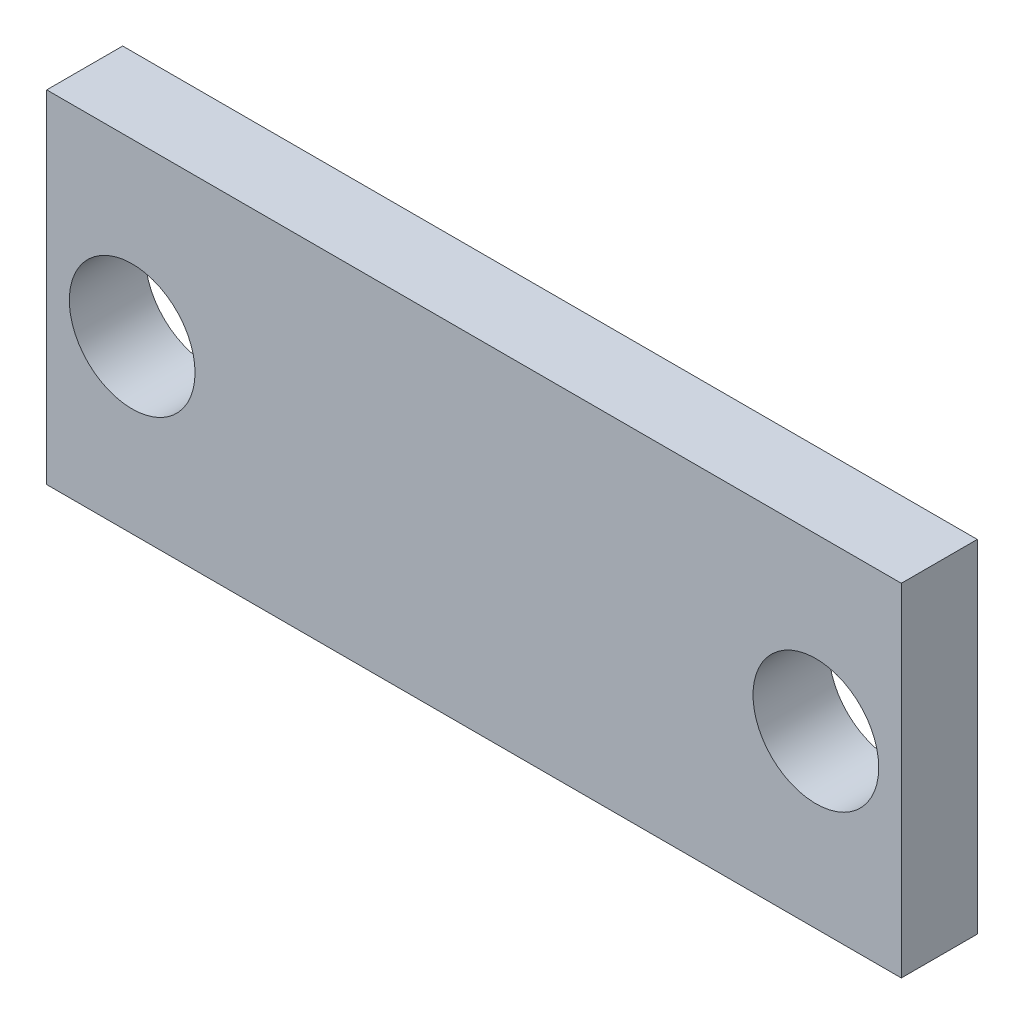
ISO-10303-21;
HEADER;
FILE_DESCRIPTION(('STEP AP214'),'2;1');
FILE_NAME('part.step','',(''),(''),'','','');
FILE_SCHEMA(('AUTOMOTIVE_DESIGN { 1 0 10303 214 1 1 1 1 }'));
ENDSEC;
DATA;
#1=APPLICATION_CONTEXT('core data for automotive mechanical design processes');
#2=APPLICATION_PROTOCOL_DEFINITION('international standard','automotive_design',2000,#1);
#3=PRODUCT_CONTEXT('',#1,'mechanical');
#4=PRODUCT('Part','Part','',(#3));
#5=PRODUCT_RELATED_PRODUCT_CATEGORY('part','',(#4));
#6=PRODUCT_DEFINITION_FORMATION('','',#4);
#7=PRODUCT_DEFINITION_CONTEXT('part definition',#1,'design');
#8=PRODUCT_DEFINITION('design','',#6,#7);
#9=PRODUCT_DEFINITION_SHAPE('','',#8);
#10=(LENGTH_UNIT() NAMED_UNIT(*) SI_UNIT(.MILLI.,.METRE.));
#11=(NAMED_UNIT(*) PLANE_ANGLE_UNIT() SI_UNIT($,.RADIAN.));
#12=(NAMED_UNIT(*) SI_UNIT($,.STERADIAN.) SOLID_ANGLE_UNIT());
#13=UNCERTAINTY_MEASURE_WITH_UNIT(LENGTH_MEASURE(1.E-05),#10,'distance_accuracy_value','');
#14=(GEOMETRIC_REPRESENTATION_CONTEXT(3) GLOBAL_UNCERTAINTY_ASSIGNED_CONTEXT((#13)) GLOBAL_UNIT_ASSIGNED_CONTEXT((#10,
#11,#12)) REPRESENTATION_CONTEXT('',''));
#15=CARTESIAN_POINT('',(0.,0.,0.));
#16=DIRECTION('',(0.,0.,1.));
#17=DIRECTION('',(1.,0.,0.));
#18=AXIS2_PLACEMENT_3D('',#15,#16,#17);
#19=CARTESIAN_POINT('',(0.,0.,2.));
#20=DIRECTION('',(0.,0.,1.));
#21=DIRECTION('',(1.,0.,0.));
#22=AXIS2_PLACEMENT_3D('',#19,#20,#21);
#23=PLANE('',#22);
#24=CARTESIAN_POINT('',(-8.37182741116752,10.1226663178173,2.));
#25=DIRECTION('',(0.,0.,1.));
#26=DIRECTION('',(1.,0.,0.));
#27=AXIS2_PLACEMENT_3D('',#24,#25,#26);
#28=CIRCLE('',#27,1.655);
#29=CARTESIAN_POINT('',(-6.71682741116751,10.1226663178173,2.));
#30=VERTEX_POINT('',#29);
#31=EDGE_CURVE('E112',#30,#30,#28,.T.);
#32=ORIENTED_EDGE('',*,*,#31,.F.);
#33=EDGE_LOOP('',(#32));
#34=FACE_BOUND('',#33,.T.);
#35=DIRECTION('',(0.,-1.,0.));
#36=VECTOR('',#35,1.);
#37=CARTESIAN_POINT('',(-10.6218274111675,14.6192893401015,2.));
#38=LINE('',#37,#36);
#39=CARTESIAN_POINT('',(-10.6218274111675,14.6192893401015,2.));
#40=VERTEX_POINT('',#39);
#41=CARTESIAN_POINT('',(-10.6218274111675,5.61928934010152,2.));
#42=VERTEX_POINT('',#41);
#43=EDGE_CURVE('E92',#40,#42,#38,.T.);
#44=ORIENTED_EDGE('',*,*,#43,.T.);
#45=DIRECTION('',(1.,0.,0.));
#46=VECTOR('',#45,1.);
#47=CARTESIAN_POINT('',(-10.6218274111675,5.61928934010152,2.));
#48=LINE('',#47,#46);
#49=CARTESIAN_POINT('',(11.8781725888325,5.61928934010152,2.));
#50=VERTEX_POINT('',#49);
#51=EDGE_CURVE('E87',#42,#50,#48,.T.);
#52=ORIENTED_EDGE('',*,*,#51,.T.);
#53=DIRECTION('',(0.,1.,0.));
#54=VECTOR('',#53,1.);
#55=CARTESIAN_POINT('',(11.8781725888325,14.6192893401015,2.));
#56=LINE('',#55,#54);
#57=CARTESIAN_POINT('',(11.8781725888325,14.6192893401015,2.));
#58=VERTEX_POINT('',#57);
#59=EDGE_CURVE('E90',#50,#58,#56,.T.);
#60=ORIENTED_EDGE('',*,*,#59,.T.);
#61=DIRECTION('',(-1.,0.,0.));
#62=VECTOR('',#61,1.);
#63=CARTESIAN_POINT('',(-10.6218274111675,14.6192893401015,2.));
#64=LINE('',#63,#62);
#65=EDGE_CURVE('E57',#58,#40,#64,.T.);
#66=ORIENTED_EDGE('',*,*,#65,.T.);
#67=EDGE_LOOP('',(#44,#52,#60,#66));
#68=FACE_BOUND('',#67,.T.);
#69=CARTESIAN_POINT('',(9.62817258883249,10.1226663178173,2.));
#70=DIRECTION('',(0.,0.,1.));
#71=DIRECTION('',(1.,0.,0.));
#72=AXIS2_PLACEMENT_3D('',#69,#70,#71);
#73=CIRCLE('',#72,1.655);
#74=CARTESIAN_POINT('',(11.2831725888325,10.1226663178173,2.));
#75=VERTEX_POINT('',#74);
#76=EDGE_CURVE('E134',#75,#75,#73,.T.);
#77=ORIENTED_EDGE('',*,*,#76,.F.);
#78=EDGE_LOOP('',(#77));
#79=FACE_BOUND('',#78,.T.);
#80=ADVANCED_FACE('F39',(#34,#68,#79),#23,.T.);
#81=CARTESIAN_POINT('',(0.,0.,0.));
#82=DIRECTION('',(0.,0.,1.));
#83=DIRECTION('',(1.,0.,0.));
#84=AXIS2_PLACEMENT_3D('',#81,#82,#83);
#85=PLANE('',#84);
#86=DIRECTION('',(0.,-1.,0.));
#87=VECTOR('',#86,1.);
#88=CARTESIAN_POINT('',(-10.6218274111675,14.6192893401015,0.));
#89=LINE('',#88,#87);
#90=CARTESIAN_POINT('',(-10.6218274111675,14.6192893401015,0.));
#91=VERTEX_POINT('',#90);
#92=CARTESIAN_POINT('',(-10.6218274111675,5.61928934010152,0.));
#93=VERTEX_POINT('',#92);
#94=EDGE_CURVE('E108',#91,#93,#89,.T.);
#95=ORIENTED_EDGE('',*,*,#94,.F.);
#96=DIRECTION('',(-1.,0.,0.));
#97=VECTOR('',#96,1.);
#98=CARTESIAN_POINT('',(-10.6218274111675,14.6192893401015,0.));
#99=LINE('',#98,#97);
#100=CARTESIAN_POINT('',(11.8781725888325,14.6192893401015,0.));
#101=VERTEX_POINT('',#100);
#102=EDGE_CURVE('E80',#101,#91,#99,.T.);
#103=ORIENTED_EDGE('',*,*,#102,.F.);
#104=DIRECTION('',(0.,1.,0.));
#105=VECTOR('',#104,1.);
#106=CARTESIAN_POINT('',(11.8781725888325,14.6192893401015,0.));
#107=LINE('',#106,#105);
#108=CARTESIAN_POINT('',(11.8781725888325,5.61928934010152,0.));
#109=VERTEX_POINT('',#108);
#110=EDGE_CURVE('E74',#109,#101,#107,.T.);
#111=ORIENTED_EDGE('',*,*,#110,.F.);
#112=DIRECTION('',(1.,0.,0.));
#113=VECTOR('',#112,1.);
#114=CARTESIAN_POINT('',(-10.6218274111675,5.61928934010152,0.));
#115=LINE('',#114,#113);
#116=EDGE_CURVE('E97',#93,#109,#115,.T.);
#117=ORIENTED_EDGE('',*,*,#116,.F.);
#118=EDGE_LOOP('',(#95,#103,#111,#117));
#119=FACE_BOUND('',#118,.T.);
#120=CARTESIAN_POINT('',(-8.37182741116752,10.1226663178173,0.));
#121=DIRECTION('',(0.,0.,1.));
#122=DIRECTION('',(1.,0.,0.));
#123=AXIS2_PLACEMENT_3D('',#120,#121,#122);
#124=CIRCLE('',#123,1.655);
#125=CARTESIAN_POINT('',(-6.71682741116751,10.1226663178173,0.));
#126=VERTEX_POINT('',#125);
#127=EDGE_CURVE('E130',#126,#126,#124,.T.);
#128=ORIENTED_EDGE('',*,*,#127,.T.);
#129=EDGE_LOOP('',(#128));
#130=FACE_BOUND('',#129,.T.);
#131=CARTESIAN_POINT('',(9.62817258883249,10.1226663178173,0.));
#132=DIRECTION('',(0.,0.,1.));
#133=DIRECTION('',(1.,0.,0.));
#134=AXIS2_PLACEMENT_3D('',#131,#132,#133);
#135=CIRCLE('',#134,1.655);
#136=CARTESIAN_POINT('',(11.2831725888325,10.1226663178173,0.));
#137=VERTEX_POINT('',#136);
#138=EDGE_CURVE('E138',#137,#137,#135,.T.);
#139=ORIENTED_EDGE('',*,*,#138,.T.);
#140=EDGE_LOOP('',(#139));
#141=FACE_BOUND('',#140,.T.);
#142=ADVANCED_FACE('F125',(#119,#130,#141),#85,.F.);
#143=CARTESIAN_POINT('',(-10.6218274111675,14.6192893401015,2.));
#144=DIRECTION('',(1.,0.,0.));
#145=DIRECTION('',(0.,1.,0.));
#146=AXIS2_PLACEMENT_3D('',#143,#144,#145);
#147=PLANE('',#146);
#148=ORIENTED_EDGE('',*,*,#94,.T.);
#149=DIRECTION('',(0.,0.,-1.));
#150=VECTOR('',#149,1.);
#151=CARTESIAN_POINT('',(-10.6218274111675,5.61928934010152,2.));
#152=LINE('',#151,#150);
#153=EDGE_CURVE('E11',#42,#93,#152,.T.);
#154=ORIENTED_EDGE('',*,*,#153,.F.);
#155=ORIENTED_EDGE('',*,*,#43,.F.);
#156=DIRECTION('',(0.,0.,-1.));
#157=VECTOR('',#156,1.);
#158=CARTESIAN_POINT('',(-10.6218274111675,14.6192893401015,2.));
#159=LINE('',#158,#157);
#160=EDGE_CURVE('E104',#40,#91,#159,.T.);
#161=ORIENTED_EDGE('',*,*,#160,.T.);
#162=EDGE_LOOP('',(#148,#154,#155,#161));
#163=FACE_BOUND('',#162,.T.);
#164=ADVANCED_FACE('F41',(#163),#147,.F.);
#165=CARTESIAN_POINT('',(-10.6218274111675,5.61928934010152,2.));
#166=DIRECTION('',(0.,1.,0.));
#167=DIRECTION('',(0.,0.,1.));
#168=AXIS2_PLACEMENT_3D('',#165,#166,#167);
#169=PLANE('',#168);
#170=ORIENTED_EDGE('',*,*,#116,.T.);
#171=DIRECTION('',(0.,0.,-1.));
#172=VECTOR('',#171,1.);
#173=CARTESIAN_POINT('',(11.8781725888325,5.61928934010152,2.));
#174=LINE('',#173,#172);
#175=EDGE_CURVE('E49',#50,#109,#174,.T.);
#176=ORIENTED_EDGE('',*,*,#175,.F.);
#177=ORIENTED_EDGE('',*,*,#51,.F.);
#178=ORIENTED_EDGE('',*,*,#153,.T.);
#179=EDGE_LOOP('',(#170,#176,#177,#178));
#180=FACE_BOUND('',#179,.T.);
#181=ADVANCED_FACE('F96',(#180),#169,.F.);
#182=CARTESIAN_POINT('',(11.8781725888325,14.6192893401015,2.));
#183=DIRECTION('',(-1.,0.,0.));
#184=DIRECTION('',(0.,-1.,0.));
#185=AXIS2_PLACEMENT_3D('',#182,#183,#184);
#186=PLANE('',#185);
#187=ORIENTED_EDGE('',*,*,#110,.T.);
#188=DIRECTION('',(0.,0.,-1.));
#189=VECTOR('',#188,1.);
#190=CARTESIAN_POINT('',(11.8781725888325,14.6192893401015,2.));
#191=LINE('',#190,#189);
#192=EDGE_CURVE('E99',#58,#101,#191,.T.);
#193=ORIENTED_EDGE('',*,*,#192,.F.);
#194=ORIENTED_EDGE('',*,*,#59,.F.);
#195=ORIENTED_EDGE('',*,*,#175,.T.);
#196=EDGE_LOOP('',(#187,#193,#194,#195));
#197=FACE_BOUND('',#196,.T.);
#198=ADVANCED_FACE('F100',(#197),#186,.F.);
#199=CARTESIAN_POINT('',(-10.6218274111675,14.6192893401015,2.));
#200=DIRECTION('',(0.,-1.,0.));
#201=DIRECTION('',(0.,0.,-1.));
#202=AXIS2_PLACEMENT_3D('',#199,#200,#201);
#203=PLANE('',#202);
#204=ORIENTED_EDGE('',*,*,#102,.T.);
#205=ORIENTED_EDGE('',*,*,#160,.F.);
#206=ORIENTED_EDGE('',*,*,#65,.F.);
#207=ORIENTED_EDGE('',*,*,#192,.T.);
#208=EDGE_LOOP('',(#204,#205,#206,#207));
#209=FACE_BOUND('',#208,.T.);
#210=ADVANCED_FACE('F122',(#209),#203,.F.);
#211=CARTESIAN_POINT('',(-8.37182741116752,10.1226663178173,2.));
#212=DIRECTION('',(0.,0.,-1.));
#213=DIRECTION('',(-1.,0.,0.));
#214=AXIS2_PLACEMENT_3D('',#211,#212,#213);
#215=CYLINDRICAL_SURFACE('',#214,1.655);
#216=ORIENTED_EDGE('',*,*,#31,.T.);
#217=EDGE_LOOP('',(#216));
#218=FACE_BOUND('',#217,.T.);
#219=ORIENTED_EDGE('',*,*,#127,.F.);
#220=EDGE_LOOP('',(#219));
#221=FACE_BOUND('',#220,.T.);
#222=ADVANCED_FACE('F157',(#218,#221),#215,.F.);
#223=CARTESIAN_POINT('',(9.62817258883249,10.1226663178173,2.));
#224=DIRECTION('',(0.,0.,-1.));
#225=DIRECTION('',(-1.,0.,0.));
#226=AXIS2_PLACEMENT_3D('',#223,#224,#225);
#227=CYLINDRICAL_SURFACE('',#226,1.655);
#228=ORIENTED_EDGE('',*,*,#76,.T.);
#229=EDGE_LOOP('',(#228));
#230=FACE_BOUND('',#229,.T.);
#231=ORIENTED_EDGE('',*,*,#138,.F.);
#232=EDGE_LOOP('',(#231));
#233=FACE_BOUND('',#232,.T.);
#234=ADVANCED_FACE('F146',(#230,#233),#227,.F.);
#235=CLOSED_SHELL('',(#80,#142,#164,#181,#198,#210,#222,#234));
#236=MANIFOLD_SOLID_BREP('B2',#235);
#237=ADVANCED_BREP_SHAPE_REPRESENTATION('',(#18,#236),#14);
#238=SHAPE_DEFINITION_REPRESENTATION(#9,#237);
ENDSEC;
END-ISO-10303-21;
